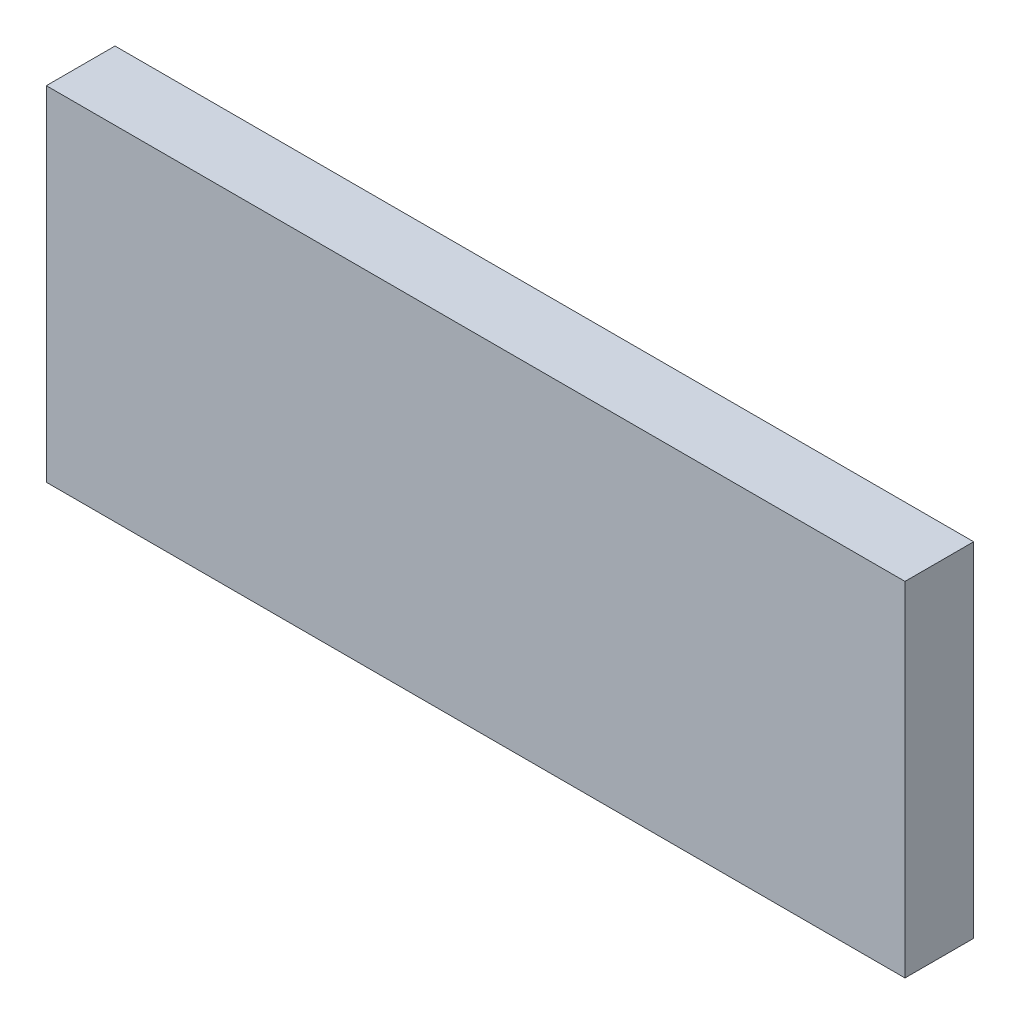
ISO-10303-21;
HEADER;
FILE_DESCRIPTION(('STEP AP214'),'2;1');
FILE_NAME('part.step','',(''),(''),'','','');
FILE_SCHEMA(('AUTOMOTIVE_DESIGN { 1 0 10303 214 1 1 1 1 }'));
ENDSEC;
DATA;
#1=APPLICATION_CONTEXT('core data for automotive mechanical design processes');
#2=APPLICATION_PROTOCOL_DEFINITION('international standard','automotive_design',2000,#1);
#3=PRODUCT_CONTEXT('',#1,'mechanical');
#4=PRODUCT('Part','Part','',(#3));
#5=PRODUCT_RELATED_PRODUCT_CATEGORY('part','',(#4));
#6=PRODUCT_DEFINITION_FORMATION('','',#4);
#7=PRODUCT_DEFINITION_CONTEXT('part definition',#1,'design');
#8=PRODUCT_DEFINITION('design','',#6,#7);
#9=PRODUCT_DEFINITION_SHAPE('','',#8);
#10=(LENGTH_UNIT() NAMED_UNIT(*) SI_UNIT(.MILLI.,.METRE.));
#11=(NAMED_UNIT(*) PLANE_ANGLE_UNIT() SI_UNIT($,.RADIAN.));
#12=(NAMED_UNIT(*) SI_UNIT($,.STERADIAN.) SOLID_ANGLE_UNIT());
#13=UNCERTAINTY_MEASURE_WITH_UNIT(LENGTH_MEASURE(1.E-05),#10,'distance_accuracy_value','');
#14=(GEOMETRIC_REPRESENTATION_CONTEXT(3) GLOBAL_UNCERTAINTY_ASSIGNED_CONTEXT((#13)) GLOBAL_UNIT_ASSIGNED_CONTEXT((#10,
#11,#12)) REPRESENTATION_CONTEXT('',''));
#15=CARTESIAN_POINT('',(0.,0.,0.));
#16=DIRECTION('',(0.,0.,1.));
#17=DIRECTION('',(1.,0.,0.));
#18=AXIS2_PLACEMENT_3D('',#15,#16,#17);
#19=CARTESIAN_POINT('',(-50.,-70.,240.));
#20=DIRECTION('',(0.,0.,1.));
#21=DIRECTION('',(1.,0.,0.));
#22=AXIS2_PLACEMENT_3D('',#19,#20,#21);
#23=PLANE('',#22);
#24=DIRECTION('',(0.,1.,0.));
#25=VECTOR('',#24,1.);
#26=CARTESIAN_POINT('',(-50.,-70.,240.));
#27=LINE('',#26,#25);
#28=CARTESIAN_POINT('',(-50.,-70.,240.));
#29=VERTEX_POINT('',#28);
#30=CARTESIAN_POINT('',(-50.,-30.,240.));
#31=VERTEX_POINT('',#30);
#32=EDGE_CURVE('E66',#29,#31,#27,.T.);
#33=ORIENTED_EDGE('',*,*,#32,.F.);
#34=DIRECTION('',(1.,0.,0.));
#35=VECTOR('',#34,1.);
#36=CARTESIAN_POINT('',(-50.,-70.,240.));
#37=LINE('',#36,#35);
#38=CARTESIAN_POINT('',(50.,-70.,240.));
#39=VERTEX_POINT('',#38);
#40=EDGE_CURVE('E58',#29,#39,#37,.T.);
#41=ORIENTED_EDGE('',*,*,#40,.T.);
#42=DIRECTION('',(0.,1.,0.));
#43=VECTOR('',#42,1.);
#44=CARTESIAN_POINT('',(50.,-70.,240.));
#45=LINE('',#44,#43);
#46=CARTESIAN_POINT('',(50.,-30.,240.));
#47=VERTEX_POINT('',#46);
#48=EDGE_CURVE('E62',#39,#47,#45,.T.);
#49=ORIENTED_EDGE('',*,*,#48,.T.);
#50=DIRECTION('',(1.,0.,0.));
#51=VECTOR('',#50,1.);
#52=CARTESIAN_POINT('',(-50.,-30.,240.));
#53=LINE('',#52,#51);
#54=EDGE_CURVE('E9',#31,#47,#53,.T.);
#55=ORIENTED_EDGE('',*,*,#54,.F.);
#56=EDGE_LOOP('',(#33,#41,#49,#55));
#57=FACE_BOUND('',#56,.T.);
#58=ADVANCED_FACE('F15',(#57),#23,.T.);
#59=CARTESIAN_POINT('',(-50.,-70.,232.));
#60=DIRECTION('',(0.,0.,1.));
#61=DIRECTION('',(1.,0.,0.));
#62=AXIS2_PLACEMENT_3D('',#59,#60,#61);
#63=PLANE('',#62);
#64=DIRECTION('',(1.,0.,0.));
#65=VECTOR('',#64,1.);
#66=CARTESIAN_POINT('',(-50.,-30.,232.));
#67=LINE('',#66,#65);
#68=CARTESIAN_POINT('',(-50.,-30.,232.));
#69=VERTEX_POINT('',#68);
#70=CARTESIAN_POINT('',(50.,-30.,232.));
#71=VERTEX_POINT('',#70);
#72=EDGE_CURVE('E25',#69,#71,#67,.T.);
#73=ORIENTED_EDGE('',*,*,#72,.T.);
#74=DIRECTION('',(0.,1.,0.));
#75=VECTOR('',#74,1.);
#76=CARTESIAN_POINT('',(50.,-70.,232.));
#77=LINE('',#76,#75);
#78=CARTESIAN_POINT('',(50.,-70.,232.));
#79=VERTEX_POINT('',#78);
#80=EDGE_CURVE('E84',#79,#71,#77,.T.);
#81=ORIENTED_EDGE('',*,*,#80,.F.);
#82=DIRECTION('',(1.,0.,0.));
#83=VECTOR('',#82,1.);
#84=CARTESIAN_POINT('',(-50.,-70.,232.));
#85=LINE('',#84,#83);
#86=CARTESIAN_POINT('',(-50.,-70.,232.));
#87=VERTEX_POINT('',#86);
#88=EDGE_CURVE('E71',#87,#79,#85,.T.);
#89=ORIENTED_EDGE('',*,*,#88,.F.);
#90=DIRECTION('',(0.,1.,0.));
#91=VECTOR('',#90,1.);
#92=CARTESIAN_POINT('',(-50.,-70.,232.));
#93=LINE('',#92,#91);
#94=EDGE_CURVE('E95',#87,#69,#93,.T.);
#95=ORIENTED_EDGE('',*,*,#94,.T.);
#96=EDGE_LOOP('',(#73,#81,#89,#95));
#97=FACE_BOUND('',#96,.T.);
#98=ADVANCED_FACE('F17',(#97),#63,.F.);
#99=CARTESIAN_POINT('',(-50.,-30.,232.));
#100=DIRECTION('',(0.,1.,0.));
#101=DIRECTION('',(1.,0.,0.));
#102=AXIS2_PLACEMENT_3D('',#99,#100,#101);
#103=PLANE('',#102);
#104=ORIENTED_EDGE('',*,*,#72,.F.);
#105=DIRECTION('',(0.,0.,1.));
#106=VECTOR('',#105,1.);
#107=CARTESIAN_POINT('',(-50.,-30.,232.));
#108=LINE('',#107,#106);
#109=EDGE_CURVE('E106',#69,#31,#108,.T.);
#110=ORIENTED_EDGE('',*,*,#109,.T.);
#111=ORIENTED_EDGE('',*,*,#54,.T.);
#112=DIRECTION('',(0.,0.,1.));
#113=VECTOR('',#112,1.);
#114=CARTESIAN_POINT('',(50.,-30.,232.));
#115=LINE('',#114,#113);
#116=EDGE_CURVE('E78',#71,#47,#115,.T.);
#117=ORIENTED_EDGE('',*,*,#116,.F.);
#118=EDGE_LOOP('',(#104,#110,#111,#117));
#119=FACE_BOUND('',#118,.T.);
#120=ADVANCED_FACE('F122',(#119),#103,.T.);
#121=CARTESIAN_POINT('',(-50.,-70.,232.));
#122=DIRECTION('',(0.,1.,0.));
#123=DIRECTION('',(1.,0.,0.));
#124=AXIS2_PLACEMENT_3D('',#121,#122,#123);
#125=PLANE('',#124);
#126=DIRECTION('',(0.,0.,1.));
#127=VECTOR('',#126,1.);
#128=CARTESIAN_POINT('',(50.,-70.,232.));
#129=LINE('',#128,#127);
#130=EDGE_CURVE('E77',#79,#39,#129,.T.);
#131=ORIENTED_EDGE('',*,*,#130,.T.);
#132=ORIENTED_EDGE('',*,*,#40,.F.);
#133=DIRECTION('',(0.,0.,1.));
#134=VECTOR('',#133,1.);
#135=CARTESIAN_POINT('',(-50.,-70.,232.));
#136=LINE('',#135,#134);
#137=EDGE_CURVE('E88',#87,#29,#136,.T.);
#138=ORIENTED_EDGE('',*,*,#137,.F.);
#139=ORIENTED_EDGE('',*,*,#88,.T.);
#140=EDGE_LOOP('',(#131,#132,#138,#139));
#141=FACE_BOUND('',#140,.T.);
#142=ADVANCED_FACE('F85',(#141),#125,.F.);
#143=CARTESIAN_POINT('',(50.,-70.,232.));
#144=DIRECTION('',(1.,0.,0.));
#145=DIRECTION('',(0.,1.,0.));
#146=AXIS2_PLACEMENT_3D('',#143,#144,#145);
#147=PLANE('',#146);
#148=ORIENTED_EDGE('',*,*,#130,.F.);
#149=ORIENTED_EDGE('',*,*,#80,.T.);
#150=ORIENTED_EDGE('',*,*,#116,.T.);
#151=ORIENTED_EDGE('',*,*,#48,.F.);
#152=EDGE_LOOP('',(#148,#149,#150,#151));
#153=FACE_BOUND('',#152,.T.);
#154=ADVANCED_FACE('F76',(#153),#147,.T.);
#155=CARTESIAN_POINT('',(-50.,-70.,232.));
#156=DIRECTION('',(1.,0.,0.));
#157=DIRECTION('',(0.,1.,0.));
#158=AXIS2_PLACEMENT_3D('',#155,#156,#157);
#159=PLANE('',#158);
#160=ORIENTED_EDGE('',*,*,#32,.T.);
#161=ORIENTED_EDGE('',*,*,#109,.F.);
#162=ORIENTED_EDGE('',*,*,#94,.F.);
#163=ORIENTED_EDGE('',*,*,#137,.T.);
#164=EDGE_LOOP('',(#160,#161,#162,#163));
#165=FACE_BOUND('',#164,.T.);
#166=ADVANCED_FACE('F115',(#165),#159,.F.);
#167=CLOSED_SHELL('',(#58,#98,#120,#142,#154,#166));
#168=MANIFOLD_SOLID_BREP('B1',#167);
#169=ADVANCED_BREP_SHAPE_REPRESENTATION('',(#18,#168),#14);
#170=SHAPE_DEFINITION_REPRESENTATION(#9,#169);
ENDSEC;
END-ISO-10303-21;
